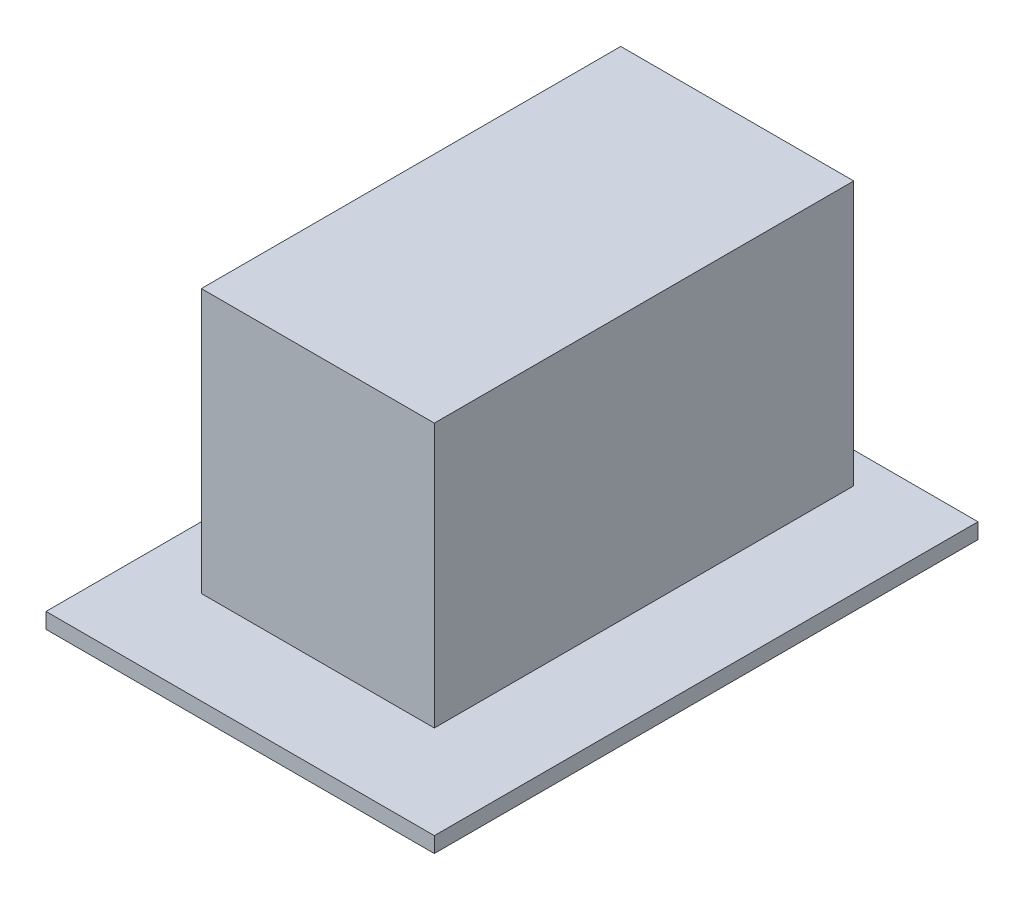
ISO-10303-21;
HEADER;
FILE_DESCRIPTION(('STEP AP214'),'2;1');
FILE_NAME('part.step','',(''),(''),'','','');
FILE_SCHEMA(('AUTOMOTIVE_DESIGN { 1 0 10303 214 1 1 1 1 }'));
ENDSEC;
DATA;
#1=APPLICATION_CONTEXT('core data for automotive mechanical design processes');
#2=APPLICATION_PROTOCOL_DEFINITION('international standard','automotive_design',2000,#1);
#3=PRODUCT_CONTEXT('',#1,'mechanical');
#4=PRODUCT('Part','Part','',(#3));
#5=PRODUCT_RELATED_PRODUCT_CATEGORY('part','',(#4));
#6=PRODUCT_DEFINITION_FORMATION('','',#4);
#7=PRODUCT_DEFINITION_CONTEXT('part definition',#1,'design');
#8=PRODUCT_DEFINITION('design','',#6,#7);
#9=PRODUCT_DEFINITION_SHAPE('','',#8);
#10=(LENGTH_UNIT() NAMED_UNIT(*) SI_UNIT(.MILLI.,.METRE.));
#11=(NAMED_UNIT(*) PLANE_ANGLE_UNIT() SI_UNIT($,.RADIAN.));
#12=(NAMED_UNIT(*) SI_UNIT($,.STERADIAN.) SOLID_ANGLE_UNIT());
#13=UNCERTAINTY_MEASURE_WITH_UNIT(LENGTH_MEASURE(1.E-05),#10,'distance_accuracy_value','');
#14=(GEOMETRIC_REPRESENTATION_CONTEXT(3) GLOBAL_UNCERTAINTY_ASSIGNED_CONTEXT((#13)) GLOBAL_UNIT_ASSIGNED_CONTEXT((#10,
#11,#12)) REPRESENTATION_CONTEXT('',''));
#15=CARTESIAN_POINT('',(0.,0.,0.));
#16=DIRECTION('',(0.,0.,1.));
#17=DIRECTION('',(1.,0.,0.));
#18=AXIS2_PLACEMENT_3D('',#15,#16,#17);
#19=CARTESIAN_POINT('',(0.,1.,0.));
#20=DIRECTION('',(0.,1.,0.));
#21=DIRECTION('',(0.,0.,1.));
#22=AXIS2_PLACEMENT_3D('',#19,#20,#21);
#23=PLANE('',#22);
#24=DIRECTION('',(0.,0.,-1.));
#25=VECTOR('',#24,1.);
#26=CARTESIAN_POINT('',(12.5,1.,-17.5));
#27=LINE('',#26,#25);
#28=CARTESIAN_POINT('',(12.5,1.,17.5));
#29=VERTEX_POINT('',#28);
#30=CARTESIAN_POINT('',(12.5,1.,-17.5));
#31=VERTEX_POINT('',#30);
#32=EDGE_CURVE('E139',#29,#31,#27,.T.);
#33=ORIENTED_EDGE('',*,*,#32,.T.);
#34=DIRECTION('',(-1.,0.,0.));
#35=VECTOR('',#34,1.);
#36=CARTESIAN_POINT('',(-12.5,1.,-17.5));
#37=LINE('',#36,#35);
#38=CARTESIAN_POINT('',(-12.5,1.,-17.5));
#39=VERTEX_POINT('',#38);
#40=EDGE_CURVE('E84',#31,#39,#37,.T.);
#41=ORIENTED_EDGE('',*,*,#40,.T.);
#42=DIRECTION('',(0.,0.,1.));
#43=VECTOR('',#42,1.);
#44=CARTESIAN_POINT('',(-12.5,1.,-17.5));
#45=LINE('',#44,#43);
#46=CARTESIAN_POINT('',(-12.5,1.,17.5));
#47=VERTEX_POINT('',#46);
#48=EDGE_CURVE('E142',#39,#47,#45,.T.);
#49=ORIENTED_EDGE('',*,*,#48,.T.);
#50=DIRECTION('',(1.,0.,0.));
#51=VECTOR('',#50,1.);
#52=CARTESIAN_POINT('',(-12.5,1.,17.5));
#53=LINE('',#52,#51);
#54=EDGE_CURVE('E56',#47,#29,#53,.T.);
#55=ORIENTED_EDGE('',*,*,#54,.T.);
#56=EDGE_LOOP('',(#33,#41,#49,#55));
#57=FACE_BOUND('',#56,.T.);
#58=DIRECTION('',(1.,0.,0.));
#59=VECTOR('',#58,1.);
#60=CARTESIAN_POINT('',(-8.49999999999999,1.,11.5));
#61=LINE('',#60,#59);
#62=CARTESIAN_POINT('',(-8.49999999999999,1.,11.5));
#63=VERTEX_POINT('',#62);
#64=CARTESIAN_POINT('',(6.5,1.,11.5));
#65=VERTEX_POINT('',#64);
#66=EDGE_CURVE('E262',#63,#65,#61,.T.);
#67=ORIENTED_EDGE('',*,*,#66,.F.);
#68=DIRECTION('',(0.,0.,1.));
#69=VECTOR('',#68,1.);
#70=CARTESIAN_POINT('',(-8.5,1.,-15.5));
#71=LINE('',#70,#69);
#72=CARTESIAN_POINT('',(-8.5,1.,-15.5));
#73=VERTEX_POINT('',#72);
#74=EDGE_CURVE('E129',#73,#63,#71,.T.);
#75=ORIENTED_EDGE('',*,*,#74,.F.);
#76=DIRECTION('',(-1.,0.,0.));
#77=VECTOR('',#76,1.);
#78=CARTESIAN_POINT('',(-8.5,1.,-15.5));
#79=LINE('',#78,#77);
#80=CARTESIAN_POINT('',(6.5,1.,-15.5));
#81=VERTEX_POINT('',#80);
#82=EDGE_CURVE('E125',#81,#73,#79,.T.);
#83=ORIENTED_EDGE('',*,*,#82,.F.);
#84=DIRECTION('',(0.,0.,-1.));
#85=VECTOR('',#84,1.);
#86=CARTESIAN_POINT('',(6.5,1.,-15.5));
#87=LINE('',#86,#85);
#88=EDGE_CURVE('E259',#65,#81,#87,.T.);
#89=ORIENTED_EDGE('',*,*,#88,.F.);
#90=EDGE_LOOP('',(#67,#75,#83,#89));
#91=FACE_BOUND('',#90,.T.);
#92=ADVANCED_FACE('F32',(#57,#91),#23,.T.);
#93=CARTESIAN_POINT('',(12.5,1.,-17.5));
#94=DIRECTION('',(-1.,0.,0.));
#95=DIRECTION('',(0.,0.,1.));
#96=AXIS2_PLACEMENT_3D('',#93,#94,#95);
#97=PLANE('',#96);
#98=DIRECTION('',(0.,0.,-1.));
#99=VECTOR('',#98,1.);
#100=CARTESIAN_POINT('',(12.5,0.,-17.5));
#101=LINE('',#100,#99);
#102=CARTESIAN_POINT('',(12.5,0.,17.5));
#103=VERTEX_POINT('',#102);
#104=CARTESIAN_POINT('',(12.5,0.,-17.5));
#105=VERTEX_POINT('',#104);
#106=EDGE_CURVE('E131',#103,#105,#101,.T.);
#107=ORIENTED_EDGE('',*,*,#106,.T.);
#108=DIRECTION('',(0.,-1.,0.));
#109=VECTOR('',#108,1.);
#110=CARTESIAN_POINT('',(12.5,1.,-17.5));
#111=LINE('',#110,#109);
#112=EDGE_CURVE('E11',#31,#105,#111,.T.);
#113=ORIENTED_EDGE('',*,*,#112,.F.);
#114=ORIENTED_EDGE('',*,*,#32,.F.);
#115=DIRECTION('',(0.,-1.,0.));
#116=VECTOR('',#115,1.);
#117=CARTESIAN_POINT('',(12.5,1.,17.5));
#118=LINE('',#117,#116);
#119=EDGE_CURVE('E144',#29,#103,#118,.T.);
#120=ORIENTED_EDGE('',*,*,#119,.T.);
#121=EDGE_LOOP('',(#107,#113,#114,#120));
#122=FACE_BOUND('',#121,.T.);
#123=ADVANCED_FACE('F34',(#122),#97,.F.);
#124=CARTESIAN_POINT('',(-12.5,1.,-17.5));
#125=DIRECTION('',(0.,0.,1.));
#126=DIRECTION('',(1.,0.,0.));
#127=AXIS2_PLACEMENT_3D('',#124,#125,#126);
#128=PLANE('',#127);
#129=DIRECTION('',(-1.,0.,0.));
#130=VECTOR('',#129,1.);
#131=CARTESIAN_POINT('',(-12.5,0.,-17.5));
#132=LINE('',#131,#130);
#133=CARTESIAN_POINT('',(-12.5,0.,-17.5));
#134=VERTEX_POINT('',#133);
#135=EDGE_CURVE('E134',#105,#134,#132,.T.);
#136=ORIENTED_EDGE('',*,*,#135,.T.);
#137=DIRECTION('',(0.,-1.,0.));
#138=VECTOR('',#137,1.);
#139=CARTESIAN_POINT('',(-12.5,1.,-17.5));
#140=LINE('',#139,#138);
#141=EDGE_CURVE('E40',#39,#134,#140,.T.);
#142=ORIENTED_EDGE('',*,*,#141,.F.);
#143=ORIENTED_EDGE('',*,*,#40,.F.);
#144=ORIENTED_EDGE('',*,*,#112,.T.);
#145=EDGE_LOOP('',(#136,#142,#143,#144));
#146=FACE_BOUND('',#145,.T.);
#147=ADVANCED_FACE('F172',(#146),#128,.F.);
#148=CARTESIAN_POINT('',(-12.5,1.,-17.5));
#149=DIRECTION('',(1.,0.,0.));
#150=DIRECTION('',(0.,0.,-1.));
#151=AXIS2_PLACEMENT_3D('',#148,#149,#150);
#152=PLANE('',#151);
#153=DIRECTION('',(0.,0.,1.));
#154=VECTOR('',#153,1.);
#155=CARTESIAN_POINT('',(-12.5,0.,-17.5));
#156=LINE('',#155,#154);
#157=CARTESIAN_POINT('',(-12.5,0.,17.5));
#158=VERTEX_POINT('',#157);
#159=EDGE_CURVE('E147',#134,#158,#156,.T.);
#160=ORIENTED_EDGE('',*,*,#159,.T.);
#161=DIRECTION('',(0.,-1.,0.));
#162=VECTOR('',#161,1.);
#163=CARTESIAN_POINT('',(-12.5,1.,17.5));
#164=LINE('',#163,#162);
#165=EDGE_CURVE('E151',#47,#158,#164,.T.);
#166=ORIENTED_EDGE('',*,*,#165,.F.);
#167=ORIENTED_EDGE('',*,*,#48,.F.);
#168=ORIENTED_EDGE('',*,*,#141,.T.);
#169=EDGE_LOOP('',(#160,#166,#167,#168));
#170=FACE_BOUND('',#169,.T.);
#171=ADVANCED_FACE('F156',(#170),#152,.F.);
#172=CARTESIAN_POINT('',(-12.5,1.,17.5));
#173=DIRECTION('',(0.,0.,-1.));
#174=DIRECTION('',(-1.,0.,0.));
#175=AXIS2_PLACEMENT_3D('',#172,#173,#174);
#176=PLANE('',#175);
#177=DIRECTION('',(1.,0.,0.));
#178=VECTOR('',#177,1.);
#179=CARTESIAN_POINT('',(-12.5,0.,17.5));
#180=LINE('',#179,#178);
#181=EDGE_CURVE('E77',#158,#103,#180,.T.);
#182=ORIENTED_EDGE('',*,*,#181,.T.);
#183=ORIENTED_EDGE('',*,*,#119,.F.);
#184=ORIENTED_EDGE('',*,*,#54,.F.);
#185=ORIENTED_EDGE('',*,*,#165,.T.);
#186=EDGE_LOOP('',(#182,#183,#184,#185));
#187=FACE_BOUND('',#186,.T.);
#188=ADVANCED_FACE('F164',(#187),#176,.F.);
#189=CARTESIAN_POINT('',(0.,0.,0.));
#190=DIRECTION('',(0.,1.,0.));
#191=DIRECTION('',(0.,0.,1.));
#192=AXIS2_PLACEMENT_3D('',#189,#190,#191);
#193=PLANE('',#192);
#194=ORIENTED_EDGE('',*,*,#106,.F.);
#195=ORIENTED_EDGE('',*,*,#181,.F.);
#196=ORIENTED_EDGE('',*,*,#159,.F.);
#197=ORIENTED_EDGE('',*,*,#135,.F.);
#198=EDGE_LOOP('',(#194,#195,#196,#197));
#199=FACE_BOUND('',#198,.T.);
#200=ADVANCED_FACE('F160',(#199),#193,.F.);
#201=CARTESIAN_POINT('',(-8.5,18.,-15.5));
#202=DIRECTION('',(1.,0.,0.));
#203=DIRECTION('',(0.,0.,-1.));
#204=AXIS2_PLACEMENT_3D('',#201,#202,#203);
#205=PLANE('',#204);
#206=ORIENTED_EDGE('',*,*,#74,.T.);
#207=DIRECTION('',(0.,-1.,0.));
#208=VECTOR('',#207,1.);
#209=CARTESIAN_POINT('',(-8.49999999999999,18.,11.5));
#210=LINE('',#209,#208);
#211=CARTESIAN_POINT('',(-8.49999999999999,18.,11.5));
#212=VERTEX_POINT('',#211);
#213=EDGE_CURVE('E110',#212,#63,#210,.T.);
#214=ORIENTED_EDGE('',*,*,#213,.F.);
#215=DIRECTION('',(0.,0.,1.));
#216=VECTOR('',#215,1.);
#217=CARTESIAN_POINT('',(-8.5,18.,-15.5));
#218=LINE('',#217,#216);
#219=CARTESIAN_POINT('',(-8.5,18.,-15.5));
#220=VERTEX_POINT('',#219);
#221=EDGE_CURVE('E117',#220,#212,#218,.T.);
#222=ORIENTED_EDGE('',*,*,#221,.F.);
#223=DIRECTION('',(0.,-1.,0.));
#224=VECTOR('',#223,1.);
#225=CARTESIAN_POINT('',(-8.5,18.,-15.5));
#226=LINE('',#225,#224);
#227=EDGE_CURVE('E257',#220,#73,#226,.T.);
#228=ORIENTED_EDGE('',*,*,#227,.T.);
#229=EDGE_LOOP('',(#206,#214,#222,#228));
#230=FACE_BOUND('',#229,.T.);
#231=ADVANCED_FACE('F127',(#230),#205,.F.);
#232=CARTESIAN_POINT('',(-8.49999999999999,18.,11.5));
#233=DIRECTION('',(0.,0.,-1.));
#234=DIRECTION('',(-1.,0.,0.));
#235=AXIS2_PLACEMENT_3D('',#232,#233,#234);
#236=PLANE('',#235);
#237=ORIENTED_EDGE('',*,*,#66,.T.);
#238=DIRECTION('',(0.,-1.,0.));
#239=VECTOR('',#238,1.);
#240=CARTESIAN_POINT('',(6.5,18.,11.5));
#241=LINE('',#240,#239);
#242=CARTESIAN_POINT('',(6.5,18.,11.5));
#243=VERTEX_POINT('',#242);
#244=EDGE_CURVE('E113',#243,#65,#241,.T.);
#245=ORIENTED_EDGE('',*,*,#244,.F.);
#246=DIRECTION('',(1.,0.,0.));
#247=VECTOR('',#246,1.);
#248=CARTESIAN_POINT('',(-8.49999999999999,18.,11.5));
#249=LINE('',#248,#247);
#250=EDGE_CURVE('E106',#212,#243,#249,.T.);
#251=ORIENTED_EDGE('',*,*,#250,.F.);
#252=ORIENTED_EDGE('',*,*,#213,.T.);
#253=EDGE_LOOP('',(#237,#245,#251,#252));
#254=FACE_BOUND('',#253,.T.);
#255=ADVANCED_FACE('F108',(#254),#236,.F.);
#256=CARTESIAN_POINT('',(6.5,18.,-15.5));
#257=DIRECTION('',(-1.,0.,0.));
#258=DIRECTION('',(0.,0.,1.));
#259=AXIS2_PLACEMENT_3D('',#256,#257,#258);
#260=PLANE('',#259);
#261=ORIENTED_EDGE('',*,*,#88,.T.);
#262=DIRECTION('',(0.,-1.,0.));
#263=VECTOR('',#262,1.);
#264=CARTESIAN_POINT('',(6.5,18.,-15.5));
#265=LINE('',#264,#263);
#266=CARTESIAN_POINT('',(6.5,18.,-15.5));
#267=VERTEX_POINT('',#266);
#268=EDGE_CURVE('E47',#267,#81,#265,.T.);
#269=ORIENTED_EDGE('',*,*,#268,.F.);
#270=DIRECTION('',(0.,0.,-1.));
#271=VECTOR('',#270,1.);
#272=CARTESIAN_POINT('',(6.5,18.,-15.5));
#273=LINE('',#272,#271);
#274=EDGE_CURVE('E116',#243,#267,#273,.T.);
#275=ORIENTED_EDGE('',*,*,#274,.F.);
#276=ORIENTED_EDGE('',*,*,#244,.T.);
#277=EDGE_LOOP('',(#261,#269,#275,#276));
#278=FACE_BOUND('',#277,.T.);
#279=ADVANCED_FACE('F185',(#278),#260,.F.);
#280=CARTESIAN_POINT('',(-8.5,18.,-15.5));
#281=DIRECTION('',(0.,0.,1.));
#282=DIRECTION('',(1.,0.,0.));
#283=AXIS2_PLACEMENT_3D('',#280,#281,#282);
#284=PLANE('',#283);
#285=ORIENTED_EDGE('',*,*,#82,.T.);
#286=ORIENTED_EDGE('',*,*,#227,.F.);
#287=DIRECTION('',(-1.,0.,0.));
#288=VECTOR('',#287,1.);
#289=CARTESIAN_POINT('',(-8.5,18.,-15.5));
#290=LINE('',#289,#288);
#291=EDGE_CURVE('E121',#267,#220,#290,.T.);
#292=ORIENTED_EDGE('',*,*,#291,.F.);
#293=ORIENTED_EDGE('',*,*,#268,.T.);
#294=EDGE_LOOP('',(#285,#286,#292,#293));
#295=FACE_BOUND('',#294,.T.);
#296=ADVANCED_FACE('F188',(#295),#284,.F.);
#297=CARTESIAN_POINT('',(0.,18.,0.));
#298=DIRECTION('',(0.,1.,0.));
#299=DIRECTION('',(0.,0.,1.));
#300=AXIS2_PLACEMENT_3D('',#297,#298,#299);
#301=PLANE('',#300);
#302=ORIENTED_EDGE('',*,*,#221,.T.);
#303=ORIENTED_EDGE('',*,*,#250,.T.);
#304=ORIENTED_EDGE('',*,*,#274,.T.);
#305=ORIENTED_EDGE('',*,*,#291,.T.);
#306=EDGE_LOOP('',(#302,#303,#304,#305));
#307=FACE_BOUND('',#306,.T.);
#308=ADVANCED_FACE('F120',(#307),#301,.T.);
#309=CLOSED_SHELL('',(#92,#123,#147,#171,#188,#200,#231,#255,#279,#296,#308));
#310=MANIFOLD_SOLID_BREP('B2',#309);
#311=ADVANCED_BREP_SHAPE_REPRESENTATION('',(#18,#310),#14);
#312=SHAPE_DEFINITION_REPRESENTATION(#9,#311);
ENDSEC;
END-ISO-10303-21;
